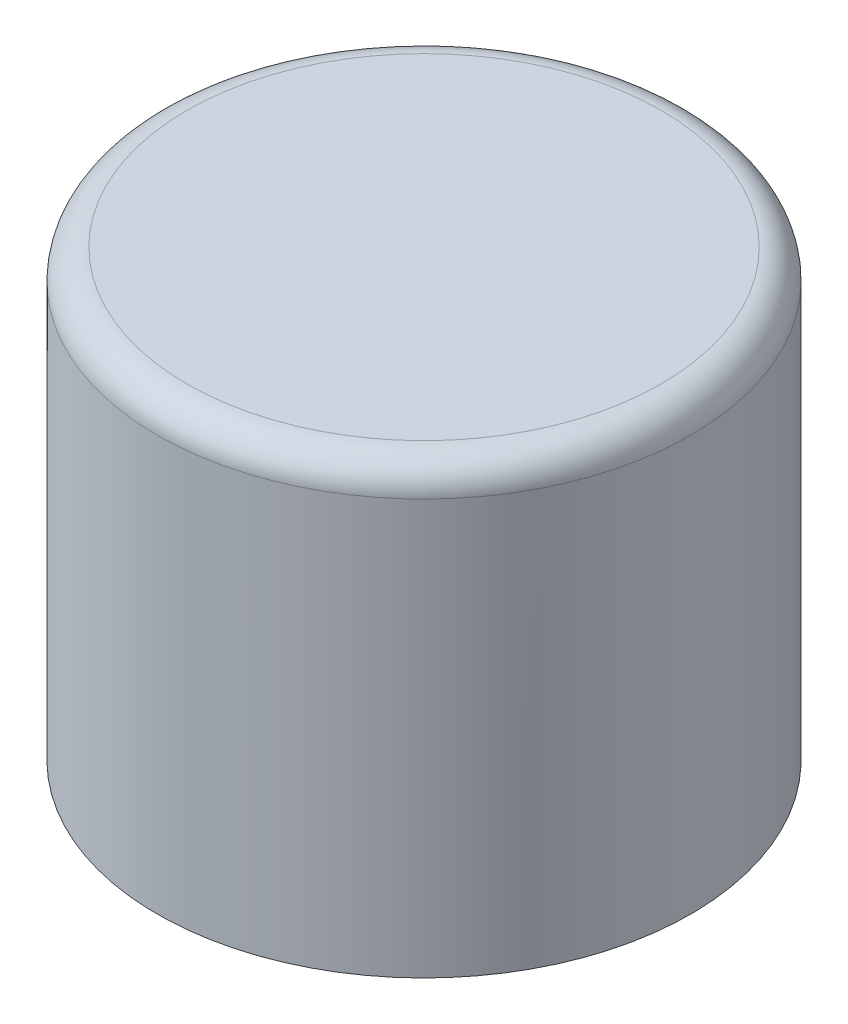
ISO-10303-21;
HEADER;
FILE_DESCRIPTION(('STEP AP214'),'2;1');
FILE_NAME('part.step','',(''),(''),'','','');
FILE_SCHEMA(('AUTOMOTIVE_DESIGN { 1 0 10303 214 1 1 1 1 }'));
ENDSEC;
DATA;
#1=APPLICATION_CONTEXT('core data for automotive mechanical design processes');
#2=APPLICATION_PROTOCOL_DEFINITION('international standard','automotive_design',2000,#1);
#3=PRODUCT_CONTEXT('',#1,'mechanical');
#4=PRODUCT('Part','Part','',(#3));
#5=PRODUCT_RELATED_PRODUCT_CATEGORY('part','',(#4));
#6=PRODUCT_DEFINITION_FORMATION('','',#4);
#7=PRODUCT_DEFINITION_CONTEXT('part definition',#1,'design');
#8=PRODUCT_DEFINITION('design','',#6,#7);
#9=PRODUCT_DEFINITION_SHAPE('','',#8);
#10=(LENGTH_UNIT() NAMED_UNIT(*) SI_UNIT(.MILLI.,.METRE.));
#11=(NAMED_UNIT(*) PLANE_ANGLE_UNIT() SI_UNIT($,.RADIAN.));
#12=(NAMED_UNIT(*) SI_UNIT($,.STERADIAN.) SOLID_ANGLE_UNIT());
#13=UNCERTAINTY_MEASURE_WITH_UNIT(LENGTH_MEASURE(1.E-05),#10,'distance_accuracy_value','');
#14=(GEOMETRIC_REPRESENTATION_CONTEXT(3) GLOBAL_UNCERTAINTY_ASSIGNED_CONTEXT((#13)) GLOBAL_UNIT_ASSIGNED_CONTEXT((#10,
#11,#12)) REPRESENTATION_CONTEXT('',''));
#15=CARTESIAN_POINT('',(0.,0.,0.));
#16=DIRECTION('',(0.,0.,1.));
#17=DIRECTION('',(1.,0.,0.));
#18=AXIS2_PLACEMENT_3D('',#15,#16,#17);
#19=CARTESIAN_POINT('',(0.,2.5,0.));
#20=DIRECTION('',(0.,1.,0.));
#21=DIRECTION('',(0.,0.,1.));
#22=AXIS2_PLACEMENT_3D('',#19,#20,#21);
#23=PLANE('',#22);
#24=CARTESIAN_POINT('',(0.,2.5,0.));
#25=DIRECTION('',(0.,1.,0.));
#26=DIRECTION('',(0.,0.,1.));
#27=AXIS2_PLACEMENT_3D('',#24,#25,#26);
#28=CIRCLE('',#27,8.);
#29=CARTESIAN_POINT('',(0.,2.5,8.));
#30=VERTEX_POINT('',#29);
#31=EDGE_CURVE('E10',#30,#30,#28,.T.);
#32=ORIENTED_EDGE('',*,*,#31,.T.);
#33=EDGE_LOOP('',(#32));
#34=FACE_BOUND('',#33,.T.);
#35=ADVANCED_FACE('F36',(#34),#23,.T.);
#36=CARTESIAN_POINT('',(0.,0.,0.));
#37=DIRECTION('',(0.,-1.,0.));
#38=DIRECTION('',(0.,0.,-1.));
#39=AXIS2_PLACEMENT_3D('',#36,#37,#38);
#40=CYLINDRICAL_SURFACE('',#39,9.);
#41=CARTESIAN_POINT('',(0.,1.5,0.));
#42=DIRECTION('',(0.,1.,0.));
#43=DIRECTION('',(0.,0.,1.));
#44=AXIS2_PLACEMENT_3D('',#41,#42,#43);
#45=CIRCLE('',#44,9.);
#46=CARTESIAN_POINT('',(0.,1.5,9.));
#47=VERTEX_POINT('',#46);
#48=EDGE_CURVE('E43',#47,#47,#45,.F.);
#49=ORIENTED_EDGE('',*,*,#48,.T.);
#50=EDGE_LOOP('',(#49));
#51=FACE_BOUND('',#50,.T.);
#52=CARTESIAN_POINT('',(0.,-12.5,0.));
#53=DIRECTION('',(0.,-1.,0.));
#54=DIRECTION('',(0.,0.,-1.));
#55=AXIS2_PLACEMENT_3D('',#52,#53,#54);
#56=CIRCLE('',#55,9.);
#57=CARTESIAN_POINT('',(0.,-12.5,-9.));
#58=VERTEX_POINT('',#57);
#59=EDGE_CURVE('E56',#58,#58,#56,.T.);
#60=ORIENTED_EDGE('',*,*,#59,.F.);
#61=EDGE_LOOP('',(#60));
#62=FACE_BOUND('',#61,.T.);
#63=ADVANCED_FACE('F92',(#51,#62),#40,.T.);
#64=CARTESIAN_POINT('',(9.,-12.5,0.));
#65=DIRECTION('',(0.,-1.,0.));
#66=DIRECTION('',(0.,0.,-1.));
#67=AXIS2_PLACEMENT_3D('',#64,#65,#66);
#68=PLANE('',#67);
#69=ORIENTED_EDGE('',*,*,#59,.T.);
#70=EDGE_LOOP('',(#69));
#71=FACE_BOUND('',#70,.T.);
#72=CARTESIAN_POINT('',(0.,-12.5,0.));
#73=DIRECTION('',(0.,-1.,0.));
#74=DIRECTION('',(0.,0.,-1.));
#75=AXIS2_PLACEMENT_3D('',#72,#73,#74);
#76=CIRCLE('',#75,8.);
#77=CARTESIAN_POINT('',(0.,-12.5,-8.));
#78=VERTEX_POINT('',#77);
#79=EDGE_CURVE('E59',#78,#78,#76,.T.);
#80=ORIENTED_EDGE('',*,*,#79,.F.);
#81=EDGE_LOOP('',(#80));
#82=FACE_BOUND('',#81,.T.);
#83=ADVANCED_FACE('F97',(#71,#82),#68,.T.);
#84=CARTESIAN_POINT('',(0.,0.,0.));
#85=DIRECTION('',(0.,-1.,0.));
#86=DIRECTION('',(0.,0.,-1.));
#87=AXIS2_PLACEMENT_3D('',#84,#85,#86);
#88=CYLINDRICAL_SURFACE('',#87,8.);
#89=CARTESIAN_POINT('',(0.,-1.,0.));
#90=DIRECTION('',(0.,-1.,0.));
#91=DIRECTION('',(0.,0.,-1.));
#92=AXIS2_PLACEMENT_3D('',#89,#90,#91);
#93=CIRCLE('',#92,8.);
#94=CARTESIAN_POINT('',(0.,-1.,-8.));
#95=VERTEX_POINT('',#94);
#96=EDGE_CURVE('E47',#95,#95,#93,.F.);
#97=ORIENTED_EDGE('',*,*,#96,.T.);
#98=EDGE_LOOP('',(#97));
#99=FACE_BOUND('',#98,.T.);
#100=ORIENTED_EDGE('',*,*,#79,.T.);
#101=EDGE_LOOP('',(#100));
#102=FACE_BOUND('',#101,.T.);
#103=ADVANCED_FACE('F113',(#99,#102),#88,.F.);
#104=CARTESIAN_POINT('',(4.,0.,0.));
#105=DIRECTION('',(0.,-1.,0.));
#106=DIRECTION('',(0.,0.,-1.));
#107=AXIS2_PLACEMENT_3D('',#104,#105,#106);
#108=PLANE('',#107);
#109=CARTESIAN_POINT('',(0.,0.,0.));
#110=DIRECTION('',(0.,-1.,0.));
#111=DIRECTION('',(0.,0.,-1.));
#112=AXIS2_PLACEMENT_3D('',#109,#110,#111);
#113=CIRCLE('',#112,7.);
#114=CARTESIAN_POINT('',(0.,0.,-7.));
#115=VERTEX_POINT('',#114);
#116=EDGE_CURVE('E51',#115,#115,#113,.T.);
#117=ORIENTED_EDGE('',*,*,#116,.T.);
#118=EDGE_LOOP('',(#117));
#119=FACE_BOUND('',#118,.T.);
#120=CARTESIAN_POINT('',(0.,0.,0.));
#121=DIRECTION('',(0.,-1.,0.));
#122=DIRECTION('',(0.,0.,-1.));
#123=AXIS2_PLACEMENT_3D('',#120,#121,#122);
#124=CIRCLE('',#123,4.);
#125=CARTESIAN_POINT('',(0.,0.,-4.));
#126=VERTEX_POINT('',#125);
#127=EDGE_CURVE('E62',#126,#126,#124,.T.);
#128=ORIENTED_EDGE('',*,*,#127,.F.);
#129=EDGE_LOOP('',(#128));
#130=FACE_BOUND('',#129,.T.);
#131=ADVANCED_FACE('F110',(#119,#130),#108,.T.);
#132=CARTESIAN_POINT('',(0.,0.,0.));
#133=DIRECTION('',(0.,-1.,0.));
#134=DIRECTION('',(0.,0.,-1.));
#135=AXIS2_PLACEMENT_3D('',#132,#133,#134);
#136=CYLINDRICAL_SURFACE('',#135,4.);
#137=ORIENTED_EDGE('',*,*,#127,.T.);
#138=EDGE_LOOP('',(#137));
#139=FACE_BOUND('',#138,.T.);
#140=CARTESIAN_POINT('',(0.,-4.,0.));
#141=DIRECTION('',(0.,-1.,0.));
#142=DIRECTION('',(0.,0.,-1.));
#143=AXIS2_PLACEMENT_3D('',#140,#141,#142);
#144=CIRCLE('',#143,4.);
#145=CARTESIAN_POINT('',(0.,-4.,-4.));
#146=VERTEX_POINT('',#145);
#147=EDGE_CURVE('E65',#146,#146,#144,.T.);
#148=ORIENTED_EDGE('',*,*,#147,.F.);
#149=EDGE_LOOP('',(#148));
#150=FACE_BOUND('',#149,.T.);
#151=ADVANCED_FACE('F88',(#139,#150),#136,.T.);
#152=CARTESIAN_POINT('',(2.5,-4.,0.));
#153=DIRECTION('',(0.,-1.,0.));
#154=DIRECTION('',(0.,0.,-1.));
#155=AXIS2_PLACEMENT_3D('',#152,#153,#154);
#156=PLANE('',#155);
#157=ORIENTED_EDGE('',*,*,#147,.T.);
#158=EDGE_LOOP('',(#157));
#159=FACE_BOUND('',#158,.T.);
#160=CARTESIAN_POINT('',(0.,-4.,0.));
#161=DIRECTION('',(0.,-1.,0.));
#162=DIRECTION('',(0.,0.,-1.));
#163=AXIS2_PLACEMENT_3D('',#160,#161,#162);
#164=CIRCLE('',#163,2.5);
#165=CARTESIAN_POINT('',(0.,-4.,-2.5));
#166=VERTEX_POINT('',#165);
#167=EDGE_CURVE('E68',#166,#166,#164,.T.);
#168=ORIENTED_EDGE('',*,*,#167,.F.);
#169=EDGE_LOOP('',(#168));
#170=FACE_BOUND('',#169,.T.);
#171=ADVANCED_FACE('F79',(#159,#170),#156,.T.);
#172=CARTESIAN_POINT('',(0.,0.,0.));
#173=DIRECTION('',(0.,-1.,0.));
#174=DIRECTION('',(0.,0.,-1.));
#175=AXIS2_PLACEMENT_3D('',#172,#173,#174);
#176=CYLINDRICAL_SURFACE('',#175,2.5);
#177=ORIENTED_EDGE('',*,*,#167,.T.);
#178=EDGE_LOOP('',(#177));
#179=FACE_BOUND('',#178,.T.);
#180=CARTESIAN_POINT('',(0.,0.,0.));
#181=DIRECTION('',(0.,-1.,0.));
#182=DIRECTION('',(0.,0.,-1.));
#183=AXIS2_PLACEMENT_3D('',#180,#181,#182);
#184=CIRCLE('',#183,2.5);
#185=CARTESIAN_POINT('',(0.,0.,-2.5));
#186=VERTEX_POINT('',#185);
#187=EDGE_CURVE('E71',#186,#186,#184,.T.);
#188=ORIENTED_EDGE('',*,*,#187,.F.);
#189=EDGE_LOOP('',(#188));
#190=FACE_BOUND('',#189,.T.);
#191=ADVANCED_FACE('F77',(#179,#190),#176,.F.);
#192=CARTESIAN_POINT('',(0.,0.,0.));
#193=DIRECTION('',(0.,-1.,0.));
#194=DIRECTION('',(0.,0.,-1.));
#195=AXIS2_PLACEMENT_3D('',#192,#193,#194);
#196=PLANE('',#195);
#197=ORIENTED_EDGE('',*,*,#187,.T.);
#198=EDGE_LOOP('',(#197));
#199=FACE_BOUND('',#198,.T.);
#200=ADVANCED_FACE('F75',(#199),#196,.T.);
#201=CARTESIAN_POINT('',(0.,-1.,0.));
#202=DIRECTION('',(0.,-1.,0.));
#203=DIRECTION('',(0.,0.,-1.));
#204=AXIS2_PLACEMENT_3D('',#201,#202,#203);
#205=TOROIDAL_SURFACE('',#204,7.,1.);
#206=ORIENTED_EDGE('',*,*,#96,.F.);
#207=EDGE_LOOP('',(#206));
#208=FACE_BOUND('',#207,.T.);
#209=ORIENTED_EDGE('',*,*,#116,.F.);
#210=EDGE_LOOP('',(#209));
#211=FACE_BOUND('',#210,.T.);
#212=ADVANCED_FACE('F86',(#208,#211),#205,.F.);
#213=CARTESIAN_POINT('',(0.,1.5,0.));
#214=DIRECTION('',(0.,1.,0.));
#215=DIRECTION('',(0.,0.,1.));
#216=AXIS2_PLACEMENT_3D('',#213,#214,#215);
#217=TOROIDAL_SURFACE('',#216,8.,1.);
#218=ORIENTED_EDGE('',*,*,#31,.F.);
#219=EDGE_LOOP('',(#218));
#220=FACE_BOUND('',#219,.T.);
#221=ORIENTED_EDGE('',*,*,#48,.F.);
#222=EDGE_LOOP('',(#221));
#223=FACE_BOUND('',#222,.T.);
#224=ADVANCED_FACE('F38',(#220,#223),#217,.T.);
#225=CLOSED_SHELL('',(#35,#63,#83,#103,#131,#151,#171,#191,#200,#212,#224));
#226=MANIFOLD_SOLID_BREP('B2',#225);
#227=ADVANCED_BREP_SHAPE_REPRESENTATION('',(#18,#226),#14);
#228=SHAPE_DEFINITION_REPRESENTATION(#9,#227);
ENDSEC;
END-ISO-10303-21;
